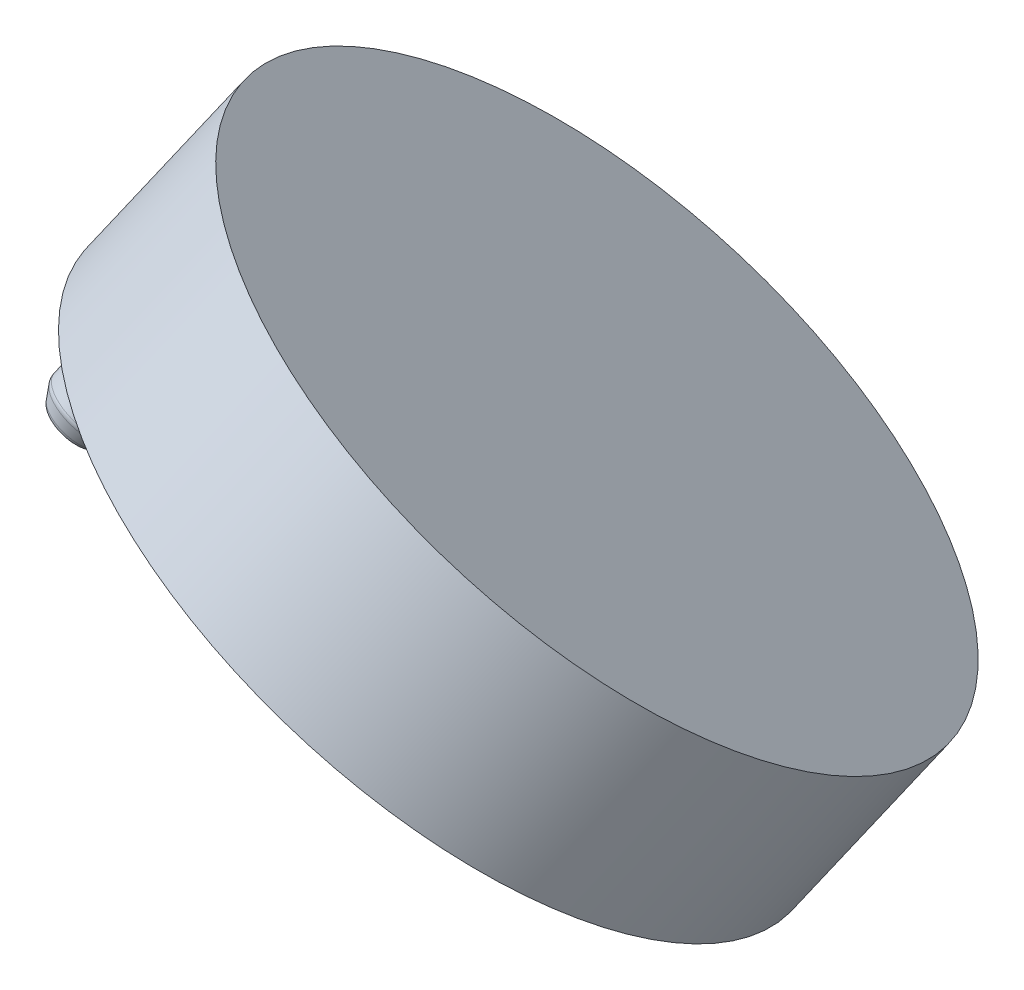
ISO-10303-21;
HEADER;
FILE_DESCRIPTION(('STEP AP214'),'2;1');
FILE_NAME('part.step','',(''),(''),'','','');
FILE_SCHEMA(('AUTOMOTIVE_DESIGN { 1 0 10303 214 1 1 1 1 }'));
ENDSEC;
DATA;
#1=APPLICATION_CONTEXT('core data for automotive mechanical design processes');
#2=APPLICATION_PROTOCOL_DEFINITION('international standard','automotive_design',2000,#1);
#3=PRODUCT_CONTEXT('',#1,'mechanical');
#4=PRODUCT('Part','Part','',(#3));
#5=PRODUCT_RELATED_PRODUCT_CATEGORY('part','',(#4));
#6=PRODUCT_DEFINITION_FORMATION('','',#4);
#7=PRODUCT_DEFINITION_CONTEXT('part definition',#1,'design');
#8=PRODUCT_DEFINITION('design','',#6,#7);
#9=PRODUCT_DEFINITION_SHAPE('','',#8);
#10=(LENGTH_UNIT() NAMED_UNIT(*) SI_UNIT(.MILLI.,.METRE.));
#11=(NAMED_UNIT(*) PLANE_ANGLE_UNIT() SI_UNIT($,.RADIAN.));
#12=(NAMED_UNIT(*) SI_UNIT($,.STERADIAN.) SOLID_ANGLE_UNIT());
#13=UNCERTAINTY_MEASURE_WITH_UNIT(LENGTH_MEASURE(1.E-05),#10,'distance_accuracy_value','');
#14=(GEOMETRIC_REPRESENTATION_CONTEXT(3) GLOBAL_UNCERTAINTY_ASSIGNED_CONTEXT((#13)) GLOBAL_UNIT_ASSIGNED_CONTEXT((#10,
#11,#12)) REPRESENTATION_CONTEXT('',''));
#15=CARTESIAN_POINT('',(0.,0.,0.));
#16=DIRECTION('',(0.,0.,1.));
#17=DIRECTION('',(1.,0.,0.));
#18=AXIS2_PLACEMENT_3D('',#15,#16,#17);
#19=CARTESIAN_POINT('',(52.6856644000798,6.81855203470048,-324.464564541766));
#20=DIRECTION('',(-0.419843522150938,-0.787526702107619,0.451146440056212));
#21=DIRECTION('',(0.,-0.497078203024789,-0.867705745098905));
#22=AXIS2_PLACEMENT_3D('',#19,#20,#21);
#23=CYLINDRICAL_SURFACE('',#22,35.2071254575037);
#24=CARTESIAN_POINT('',(42.7325198838464,-11.8511824328279,-313.769328152602));
#25=DIRECTION('',(0.419843522150938,0.787526702107619,-0.451146440056212));
#26=DIRECTION('',(0.,0.497078203024789,0.867705745098905));
#27=AXIS2_PLACEMENT_3D('',#24,#25,#26);
#28=CIRCLE('',#27,35.2071254575037);
#29=CARTESIAN_POINT('',(42.7325198838464,5.64951222325637,-283.219903124708));
#30=VERTEX_POINT('',#29);
#31=EDGE_CURVE('E120',#30,#30,#28,.T.);
#32=ORIENTED_EDGE('',*,*,#31,.T.);
#33=EDGE_LOOP('',(#32));
#34=FACE_BOUND('',#33,.T.);
#35=CARTESIAN_POINT('',(35.8079548096121,-24.8400213900258,-306.328477651507));
#36=DIRECTION('',(-0.419843522150938,-0.787526702107619,0.451146440056211));
#37=DIRECTION('',(0.,-0.497078203024789,-0.867705745098905));
#38=AXIS2_PLACEMENT_3D('',#35,#36,#37);
#39=CIRCLE('',#38,35.2071254575037);
#40=CARTESIAN_POINT('',(35.8079548096121,-42.3407160461101,-336.877902679401));
#41=VERTEX_POINT('',#40);
#42=EDGE_CURVE('E138',#41,#41,#39,.T.);
#43=ORIENTED_EDGE('',*,*,#42,.T.);
#44=EDGE_LOOP('',(#43));
#45=FACE_BOUND('',#44,.T.);
#46=ADVANCED_FACE('F46',(#34,#45),#23,.F.);
#47=CARTESIAN_POINT('',(57.0670686657183,-35.8673241933257,-372.291082093119));
#48=DIRECTION('',(-0.419843522150938,-0.787526702107619,0.451146440056211));
#49=DIRECTION('',(0.,-0.497078203024789,-0.867705745098905));
#50=AXIS2_PLACEMENT_3D('',#47,#48,#49);
#51=CYLINDRICAL_SURFACE('',#50,7.9375);
#52=CARTESIAN_POINT('',(44.9965674038789,-58.5087168789197,-359.320621941503));
#53=DIRECTION('',(-0.419843522150934,-0.78752670210762,0.451146440056212));
#54=DIRECTION('',(0.,-0.497078203024789,-0.867705745098906));
#55=AXIS2_PLACEMENT_3D('',#52,#53,#54);
#56=CIRCLE('',#55,7.9375);
#57=CARTESIAN_POINT('',(44.9965674038789,-62.454275115429,-366.208036293226));
#58=VERTEX_POINT('',#57);
#59=EDGE_CURVE('E74',#58,#58,#56,.T.);
#60=ORIENTED_EDGE('',*,*,#59,.T.);
#61=EDGE_LOOP('',(#60));
#62=FACE_BOUND('',#61,.T.);
#63=CARTESIAN_POINT('',(53.0757021640282,-43.3541794909259,-368.002125152753));
#64=DIRECTION('',(0.419843522150938,0.787526702107619,-0.451146440056212));
#65=DIRECTION('',(0.,0.497078203024789,0.867705745098905));
#66=AXIS2_PLACEMENT_3D('',#63,#64,#65);
#67=CIRCLE('',#66,7.9375);
#68=CARTESIAN_POINT('',(53.0757021640282,-39.4086212544166,-361.11471080103));
#69=VERTEX_POINT('',#68);
#70=EDGE_CURVE('E127',#69,#69,#67,.F.);
#71=ORIENTED_EDGE('',*,*,#70,.F.);
#72=EDGE_LOOP('',(#71));
#73=FACE_BOUND('',#72,.T.);
#74=ADVANCED_FACE('F186',(#62,#73),#51,.F.);
#75=CARTESIAN_POINT('',(-5.27065020165846,31.8518464060446,-312.092075233912));
#76=DIRECTION('',(-0.419843522150938,-0.787526702107619,0.451146440056211));
#77=DIRECTION('',(0.,-0.497078203024789,-0.867705745098905));
#78=AXIS2_PLACEMENT_3D('',#75,#76,#77);
#79=CYLINDRICAL_SURFACE('',#78,7.9375);
#80=CARTESIAN_POINT('',(-17.3411514634979,9.21045372045059,-299.121615082296));
#81=DIRECTION('',(-0.419843522150937,-0.787526702107617,0.451146440056215));
#82=DIRECTION('',(0.,-0.497078203024793,-0.867705745098903));
#83=AXIS2_PLACEMENT_3D('',#80,#81,#82);
#84=CIRCLE('',#83,7.9375);
#85=CARTESIAN_POINT('',(-17.3411514634979,5.2648954839413,-306.009029434018));
#86=VERTEX_POINT('',#85);
#87=EDGE_CURVE('E10',#86,#86,#84,.T.);
#88=ORIENTED_EDGE('',*,*,#87,.T.);
#89=EDGE_LOOP('',(#88));
#90=FACE_BOUND('',#89,.T.);
#91=CARTESIAN_POINT('',(-9.2620167033486,24.3649911084444,-307.803118293545));
#92=DIRECTION('',(0.419843522150938,0.787526702107619,-0.451146440056212));
#93=DIRECTION('',(0.,0.497078203024789,0.867705745098905));
#94=AXIS2_PLACEMENT_3D('',#91,#92,#93);
#95=CIRCLE('',#94,7.9375);
#96=CARTESIAN_POINT('',(-9.2620167033486,28.3105493449537,-300.915703941823));
#97=VERTEX_POINT('',#96);
#98=EDGE_CURVE('E152',#97,#97,#95,.F.);
#99=ORIENTED_EDGE('',*,*,#98,.F.);
#100=EDGE_LOOP('',(#99));
#101=FACE_BOUND('',#100,.T.);
#102=ADVANCED_FACE('F191',(#90,#101),#79,.F.);
#103=CARTESIAN_POINT('',(39.781336329203,33.470727202409,-267.340095018432));
#104=DIRECTION('',(-0.419843522150938,-0.787526702107619,0.451146440056211));
#105=DIRECTION('',(0.,-0.497078203024789,-0.867705745098905));
#106=AXIS2_PLACEMENT_3D('',#103,#104,#105);
#107=CYLINDRICAL_SURFACE('',#106,7.9375);
#108=CARTESIAN_POINT('',(27.7108350673636,10.829334516815,-254.369634866816));
#109=DIRECTION('',(-0.419843522150935,-0.787526702107613,0.451146440056224));
#110=DIRECTION('',(0.,-0.497078203024802,-0.867705745098898));
#111=AXIS2_PLACEMENT_3D('',#108,#109,#110);
#112=CIRCLE('',#111,7.9375);
#113=CARTESIAN_POINT('',(27.7108350673636,6.88377628030566,-261.257049218539));
#114=VERTEX_POINT('',#113);
#115=EDGE_CURVE('E55',#114,#114,#112,.T.);
#116=ORIENTED_EDGE('',*,*,#115,.T.);
#117=EDGE_LOOP('',(#116));
#118=FACE_BOUND('',#117,.T.);
#119=CARTESIAN_POINT('',(35.7899698275128,25.9838719048088,-263.051138078066));
#120=DIRECTION('',(0.419843522150938,0.787526702107619,-0.451146440056212));
#121=DIRECTION('',(0.,0.497078203024789,0.867705745098905));
#122=AXIS2_PLACEMENT_3D('',#119,#120,#121);
#123=CIRCLE('',#122,7.9375);
#124=CARTESIAN_POINT('',(35.7899698275128,29.929430141318,-256.163723726343));
#125=VERTEX_POINT('',#124);
#126=EDGE_CURVE('E156',#125,#125,#123,.F.);
#127=ORIENTED_EDGE('',*,*,#126,.F.);
#128=EDGE_LOOP('',(#127));
#129=FACE_BOUND('',#128,.T.);
#130=ADVANCED_FACE('F182',(#118,#129),#107,.F.);
#131=CARTESIAN_POINT('',(93.4614470495499,0.415666833468258,-275.085907942506));
#132=DIRECTION('',(-0.419843522150938,-0.787526702107619,0.451146440056211));
#133=DIRECTION('',(0.,-0.497078203024789,-0.867705745098905));
#134=AXIS2_PLACEMENT_3D('',#131,#132,#133);
#135=CYLINDRICAL_SURFACE('',#134,7.9375);
#136=CARTESIAN_POINT('',(81.3909457877105,-22.2257258521259,-262.11544779089));
#137=DIRECTION('',(-0.419843522150937,-0.787526702107626,0.4511464400562));
#138=DIRECTION('',(0.,-0.497078203024776,-0.867705745098913));
#139=AXIS2_PLACEMENT_3D('',#136,#137,#138);
#140=CIRCLE('',#139,7.9375);
#141=CARTESIAN_POINT('',(81.3909457877105,-26.171284088635,-269.002862142613));
#142=VERTEX_POINT('',#141);
#143=EDGE_CURVE('E62',#142,#142,#140,.T.);
#144=ORIENTED_EDGE('',*,*,#143,.T.);
#145=EDGE_LOOP('',(#144));
#146=FACE_BOUND('',#145,.T.);
#147=CARTESIAN_POINT('',(89.4700805478598,-7.07118846413194,-270.79695100214));
#148=DIRECTION('',(0.419843522150938,0.787526702107619,-0.451146440056212));
#149=DIRECTION('',(0.,0.497078203024789,0.867705745098905));
#150=AXIS2_PLACEMENT_3D('',#147,#148,#149);
#151=CIRCLE('',#150,7.9375);
#152=CARTESIAN_POINT('',(89.4700805478598,-3.12563022762267,-263.909536650417));
#153=VERTEX_POINT('',#152);
#154=EDGE_CURVE('E160',#153,#153,#151,.F.);
#155=ORIENTED_EDGE('',*,*,#154,.F.);
#156=EDGE_LOOP('',(#155));
#157=FACE_BOUND('',#156,.T.);
#158=ADVANCED_FACE('F173',(#146,#157),#135,.F.);
#159=CARTESIAN_POINT('',(102.101617059717,-34.2346517905639,-327.531255269114));
#160=DIRECTION('',(-0.419843522150938,-0.787526702107619,0.451146440056211));
#161=DIRECTION('',(0.,-0.497078203024789,-0.867705745098905));
#162=AXIS2_PLACEMENT_3D('',#159,#160,#161);
#163=CYLINDRICAL_SURFACE('',#162,7.93750000000003);
#164=CARTESIAN_POINT('',(90.031115797878,-56.876044476158,-314.560795117497));
#165=DIRECTION('',(-0.419843522150933,-0.787526702107617,0.45114644005622));
#166=DIRECTION('',(0.,-0.497078203024797,-0.867705745098901));
#167=AXIS2_PLACEMENT_3D('',#164,#165,#166);
#168=CIRCLE('',#167,7.93750000000003);
#169=CARTESIAN_POINT('',(90.031115797878,-60.8216027126674,-321.44820946922));
#170=VERTEX_POINT('',#169);
#171=EDGE_CURVE('E69',#170,#170,#168,.T.);
#172=ORIENTED_EDGE('',*,*,#171,.T.);
#173=EDGE_LOOP('',(#172));
#174=FACE_BOUND('',#173,.T.);
#175=CARTESIAN_POINT('',(98.1102505580274,-41.7215070881641,-323.242298328747));
#176=DIRECTION('',(0.419843522150938,0.787526702107619,-0.451146440056212));
#177=DIRECTION('',(0.,0.497078203024789,0.867705745098905));
#178=AXIS2_PLACEMENT_3D('',#175,#176,#177);
#179=CIRCLE('',#178,7.93750000000003);
#180=CARTESIAN_POINT('',(98.1102505580274,-37.7759488516548,-316.354883977025));
#181=VERTEX_POINT('',#180);
#182=EDGE_CURVE('E132',#181,#181,#179,.F.);
#183=ORIENTED_EDGE('',*,*,#182,.F.);
#184=EDGE_LOOP('',(#183));
#185=FACE_BOUND('',#184,.T.);
#186=ADVANCED_FACE('F170',(#174,#185),#163,.F.);
#187=CARTESIAN_POINT('',(3.35977886493976,-2.81049163858387,-364.567468872575));
#188=DIRECTION('',(-0.419843522150938,-0.787526702107619,0.451146440056211));
#189=DIRECTION('',(0.,-0.497078203024789,-0.867705745098905));
#190=AXIS2_PLACEMENT_3D('',#187,#188,#189);
#191=CYLINDRICAL_SURFACE('',#190,7.9375);
#192=CARTESIAN_POINT('',(-8.71072239689973,-25.451884324178,-351.597008720959));
#193=DIRECTION('',(-0.419843522150941,-0.787526702107623,0.451146440056202));
#194=DIRECTION('',(0.,-0.49707820302478,-0.867705745098911));
#195=AXIS2_PLACEMENT_3D('',#192,#193,#194);
#196=CIRCLE('',#195,7.9375);
#197=CARTESIAN_POINT('',(-8.71072239689973,-29.3974425606872,-358.484423072681));
#198=VERTEX_POINT('',#197);
#199=EDGE_CURVE('E100',#198,#198,#196,.T.);
#200=ORIENTED_EDGE('',*,*,#199,.T.);
#201=EDGE_LOOP('',(#200));
#202=FACE_BOUND('',#201,.T.);
#203=CARTESIAN_POINT('',(-0.631587636750388,-10.2973469361841,-360.278511932209));
#204=DIRECTION('',(0.419843522150938,0.787526702107619,-0.451146440056212));
#205=DIRECTION('',(0.,0.497078203024789,0.867705745098905));
#206=AXIS2_PLACEMENT_3D('',#203,#204,#205);
#207=CIRCLE('',#206,7.9375);
#208=CARTESIAN_POINT('',(-0.631587636750388,-6.3517886996748,-353.391097580486));
#209=VERTEX_POINT('',#208);
#210=EDGE_CURVE('E128',#209,#209,#207,.F.);
#211=ORIENTED_EDGE('',*,*,#210,.F.);
#212=EDGE_LOOP('',(#211));
#213=FACE_BOUND('',#212,.T.);
#214=ADVANCED_FACE('F172',(#202,#213),#191,.F.);
#215=CARTESIAN_POINT('',(52.6856644000798,6.81855203470048,-324.464564541766));
#216=DIRECTION('',(-0.419843522150938,-0.787526702107619,0.451146440056212));
#217=DIRECTION('',(0.,-0.497078203024789,-0.867705745098905));
#218=AXIS2_PLACEMENT_3D('',#215,#216,#217);
#219=CYLINDRICAL_SURFACE('',#218,76.2);
#220=CARTESIAN_POINT('',(52.6856644000798,6.81855203470048,-324.464564541766));
#221=DIRECTION('',(-0.419843522150938,-0.787526702107619,0.451146440056211));
#222=DIRECTION('',(0.,-0.497078203024789,-0.867705745098905));
#223=AXIS2_PLACEMENT_3D('',#220,#221,#222);
#224=CIRCLE('',#223,76.2);
#225=CARTESIAN_POINT('',(52.6856644000798,-31.0588070357884,-390.583742318303));
#226=VERTEX_POINT('',#225);
#227=EDGE_CURVE('E133',#226,#226,#224,.T.);
#228=ORIENTED_EDGE('',*,*,#227,.T.);
#229=EDGE_LOOP('',(#228));
#230=FACE_BOUND('',#229,.T.);
#231=CARTESIAN_POINT('',(35.8079548096121,-24.8400213900258,-306.328477651507));
#232=DIRECTION('',(-0.419843522150938,-0.787526702107619,0.451146440056211));
#233=DIRECTION('',(0.,-0.497078203024789,-0.867705745098905));
#234=AXIS2_PLACEMENT_3D('',#231,#232,#233);
#235=CIRCLE('',#234,76.2);
#236=CARTESIAN_POINT('',(35.8079548096121,-62.7173804605147,-372.447655428043));
#237=VERTEX_POINT('',#236);
#238=EDGE_CURVE('E134',#237,#237,#235,.T.);
#239=ORIENTED_EDGE('',*,*,#238,.F.);
#240=EDGE_LOOP('',(#239));
#241=FACE_BOUND('',#240,.T.);
#242=ADVANCED_FACE('F179',(#230,#241),#219,.T.);
#243=CARTESIAN_POINT('',(52.6856644000798,6.81855203470048,-324.464564541766));
#244=DIRECTION('',(-0.419843522150938,-0.787526702107619,0.451146440056211));
#245=DIRECTION('',(0.,-0.497078203024789,-0.867705745098905));
#246=AXIS2_PLACEMENT_3D('',#243,#244,#245);
#247=PLANE('',#246);
#248=ORIENTED_EDGE('',*,*,#227,.F.);
#249=EDGE_LOOP('',(#248));
#250=FACE_BOUND('',#249,.T.);
#251=ADVANCED_FACE('F197',(#250),#247,.F.);
#252=CARTESIAN_POINT('',(35.8079548096121,-24.8400213900258,-306.328477651507));
#253=DIRECTION('',(-0.419843522150938,-0.787526702107619,0.451146440056211));
#254=DIRECTION('',(0.,-0.497078203024789,-0.867705745098905));
#255=AXIS2_PLACEMENT_3D('',#252,#253,#254);
#256=PLANE('',#255);
#257=CARTESIAN_POINT('',(-9.23552679958838,-26.4362927018125,-351.033075670889));
#258=DIRECTION('',(-0.419843522150938,-0.787526702107619,0.451146440056211));
#259=DIRECTION('',(0.,-0.497078203024789,-0.867705745098905));
#260=AXIS2_PLACEMENT_3D('',#257,#258,#259);
#261=CIRCLE('',#260,9.18750000000008);
#262=CARTESIAN_POINT('',(-9.23552679958838,-31.0031986921028,-359.005122203985));
#263=VERTEX_POINT('',#262);
#264=EDGE_CURVE('E77',#263,#263,#261,.F.);
#265=ORIENTED_EDGE('',*,*,#264,.T.);
#266=EDGE_LOOP('',(#265));
#267=FACE_BOUND('',#266,.T.);
#268=CARTESIAN_POINT('',(44.4717630011902,-59.4931252565543,-358.756688891433));
#269=DIRECTION('',(-0.419843522150938,-0.787526702107619,0.451146440056211));
#270=DIRECTION('',(0.,-0.497078203024789,-0.867705745098905));
#271=AXIS2_PLACEMENT_3D('',#268,#269,#270);
#272=CIRCLE('',#271,9.1875);
#273=CARTESIAN_POINT('',(44.4717630011902,-64.0600312468445,-366.728735424529));
#274=VERTEX_POINT('',#273);
#275=EDGE_CURVE('E81',#274,#274,#272,.F.);
#276=ORIENTED_EDGE('',*,*,#275,.T.);
#277=EDGE_LOOP('',(#276));
#278=FACE_BOUND('',#277,.T.);
#279=CARTESIAN_POINT('',(89.5063113951894,-57.8604528537925,-313.996862067427));
#280=DIRECTION('',(-0.419843522150938,-0.787526702107619,0.451146440056211));
#281=DIRECTION('',(0.,-0.497078203024789,-0.867705745098905));
#282=AXIS2_PLACEMENT_3D('',#279,#280,#281);
#283=CIRCLE('',#282,9.18749999999991);
#284=CARTESIAN_POINT('',(89.5063113951894,-62.4273588440827,-321.968908600523));
#285=VERTEX_POINT('',#284);
#286=EDGE_CURVE('E85',#285,#285,#283,.F.);
#287=ORIENTED_EDGE('',*,*,#286,.T.);
#288=EDGE_LOOP('',(#287));
#289=FACE_BOUND('',#288,.T.);
#290=CARTESIAN_POINT('',(80.8661413850218,-23.2101342297603,-261.55151474082));
#291=DIRECTION('',(-0.419843522150938,-0.787526702107619,0.451146440056211));
#292=DIRECTION('',(0.,-0.497078203024789,-0.867705745098905));
#293=AXIS2_PLACEMENT_3D('',#290,#291,#292);
#294=CIRCLE('',#293,9.18750000000012);
#295=CARTESIAN_POINT('',(80.8661413850218,-27.7770402200507,-269.523561273916));
#296=VERTEX_POINT('',#295);
#297=EDGE_CURVE('E89',#296,#296,#294,.F.);
#298=ORIENTED_EDGE('',*,*,#297,.T.);
#299=EDGE_LOOP('',(#298));
#300=FACE_BOUND('',#299,.T.);
#301=CARTESIAN_POINT('',(27.1860306646748,9.84492613918036,-253.805701816746));
#302=DIRECTION('',(-0.419843522150938,-0.787526702107619,0.451146440056211));
#303=DIRECTION('',(0.,-0.497078203024789,-0.867705745098905));
#304=AXIS2_PLACEMENT_3D('',#301,#302,#303);
#305=CIRCLE('',#304,9.1875);
#306=CARTESIAN_POINT('',(27.1860306646748,5.27802014889011,-261.777748349842));
#307=VERTEX_POINT('',#306);
#308=EDGE_CURVE('E93',#307,#307,#305,.F.);
#309=ORIENTED_EDGE('',*,*,#308,.T.);
#310=EDGE_LOOP('',(#309));
#311=FACE_BOUND('',#310,.T.);
#312=CARTESIAN_POINT('',(-17.8659558661866,8.22604534281602,-298.557682032225));
#313=DIRECTION('',(-0.419843522150938,-0.787526702107619,0.451146440056211));
#314=DIRECTION('',(0.,-0.497078203024789,-0.867705745098905));
#315=AXIS2_PLACEMENT_3D('',#312,#313,#314);
#316=CIRCLE('',#315,9.18749999999996);
#317=CARTESIAN_POINT('',(-17.8659558661866,3.65913935252579,-306.529728565321));
#318=VERTEX_POINT('',#317);
#319=EDGE_CURVE('E96',#318,#318,#316,.F.);
#320=ORIENTED_EDGE('',*,*,#319,.T.);
#321=EDGE_LOOP('',(#320));
#322=FACE_BOUND('',#321,.T.);
#323=CARTESIAN_POINT('',(-0.147060364526407,14.2556897080688,-271.542796496672));
#324=DIRECTION('',(-0.419843522150938,-0.787526702107619,0.451146440056211));
#325=DIRECTION('',(0.,-0.497078203024789,-0.867705745098905));
#326=AXIS2_PLACEMENT_3D('',#323,#324,#325);
#327=CIRCLE('',#326,7.77968966364629);
#328=CARTESIAN_POINT('',(-0.147060364526407,10.3885755499729,-278.293277912905));
#329=VERTEX_POINT('',#328);
#330=EDGE_CURVE('E145',#329,#329,#327,.T.);
#331=ORIENTED_EDGE('',*,*,#330,.F.);
#332=EDGE_LOOP('',(#331));
#333=FACE_BOUND('',#332,.T.);
#334=ORIENTED_EDGE('',*,*,#42,.F.);
#335=EDGE_LOOP('',(#334));
#336=FACE_BOUND('',#335,.T.);
#337=ORIENTED_EDGE('',*,*,#238,.T.);
#338=EDGE_LOOP('',(#337));
#339=FACE_BOUND('',#338,.T.);
#340=ADVANCED_FACE('F200',(#267,#278,#289,#300,#311,#322,#333,#336,#339),#256,.T.);
#341=CARTESIAN_POINT('',(-5.46608724942705,4.27845895403172,-265.827190760058));
#342=DIRECTION('',(0.419843522150938,0.787526702107619,-0.451146440056211));
#343=DIRECTION('',(0.,0.497078203024789,0.867705745098905));
#344=AXIS2_PLACEMENT_3D('',#341,#342,#343);
#345=CYLINDRICAL_SURFACE('',#344,7.77968966364629);
#346=CARTESIAN_POINT('',(-3.56251350800053,7.84911104632562,-267.872692170749));
#347=DIRECTION('',(-0.419843522150937,-0.787526702107619,0.451146440056212));
#348=DIRECTION('',(0.,-0.49707820302479,-0.867705745098905));
#349=AXIS2_PLACEMENT_3D('',#346,#347,#348);
#350=CIRCLE('',#349,7.77968966364629);
#351=CARTESIAN_POINT('',(-3.56251350800053,3.98199688822979,-274.623173586981));
#352=VERTEX_POINT('',#351);
#353=EDGE_CURVE('E104',#352,#352,#350,.F.);
#354=ORIENTED_EDGE('',*,*,#353,.T.);
#355=EDGE_LOOP('',(#354));
#356=FACE_BOUND('',#355,.T.);
#357=ORIENTED_EDGE('',*,*,#330,.T.);
#358=EDGE_LOOP('',(#357));
#359=FACE_BOUND('',#358,.T.);
#360=ADVANCED_FACE('F204',(#356,#359),#345,.T.);
#361=CARTESIAN_POINT('',(-5.46608724942705,4.27845895403172,-265.827190760058));
#362=DIRECTION('',(-0.419843522150938,-0.787526702107619,0.451146440056211));
#363=DIRECTION('',(0.,-0.497078203024789,-0.867705745098905));
#364=AXIS2_PLACEMENT_3D('',#361,#362,#363);
#365=PLANE('',#364);
#366=CARTESIAN_POINT('',(-5.46608724942704,4.27845895403173,-265.827190760058));
#367=DIRECTION('',(-0.419843522150938,-0.787526702107619,0.451146440056211));
#368=DIRECTION('',(0.,-0.497078203024789,-0.867705745098905));
#369=AXIS2_PLACEMENT_3D('',#366,#367,#368);
#370=CIRCLE('',#369,4.32263526463448);
#371=CARTESIAN_POINT('',(-5.46608724942704,2.12977118435564,-269.577966213149));
#372=VERTEX_POINT('',#371);
#373=EDGE_CURVE('E116',#372,#372,#370,.T.);
#374=ORIENTED_EDGE('',*,*,#373,.T.);
#375=EDGE_LOOP('',(#374));
#376=FACE_BOUND('',#375,.T.);
#377=ADVANCED_FACE('F217',(#376),#365,.T.);
#378=CARTESIAN_POINT('',(-5.46608724942705,4.27845895403172,-265.827190760058));
#379=DIRECTION('',(0.419843522150937,0.787526702107618,-0.451146440056213));
#380=DIRECTION('',(0.,0.497078203024791,0.867705745098904));
#381=AXIS2_PLACEMENT_3D('',#378,#379,#380);
#382=CONICAL_SURFACE('',#381,5.47968966364636,0.521834279814398);
#383=CARTESIAN_POINT('',(-5.04495995012327,5.06839371708128,-266.279716693811));
#384=DIRECTION('',(-0.419843522150938,-0.787526702107619,0.451146440056211));
#385=DIRECTION('',(0.,-0.497078203024789,-0.867705745098905));
#386=AXIS2_PLACEMENT_3D('',#383,#384,#385);
#387=CIRCLE('',#386,6.05644787074955);
#388=CARTESIAN_POINT('',(-5.04495995012327,2.05786549277578,-271.534931306152));
#389=VERTEX_POINT('',#388);
#390=EDGE_CURVE('E108',#389,#389,#387,.F.);
#391=ORIENTED_EDGE('',*,*,#390,.T.);
#392=EDGE_LOOP('',(#391));
#393=FACE_BOUND('',#392,.T.);
#394=CARTESIAN_POINT('',(-3.98107325299862,7.06399240515995,-267.422925224389));
#395=DIRECTION('',(0.419843522150937,0.787526702107618,-0.451146440056213));
#396=DIRECTION('',(0.,0.497078203024791,0.867705745098904));
#397=AXIS2_PLACEMENT_3D('',#394,#395,#396);
#398=CIRCLE('',#397,7.51350226976141);
#399=CARTESIAN_POINT('',(-3.98107325299862,10.7987906118356,-260.903416139104));
#400=VERTEX_POINT('',#399);
#401=EDGE_CURVE('E112',#400,#400,#398,.F.);
#402=ORIENTED_EDGE('',*,*,#401,.T.);
#403=EDGE_LOOP('',(#402));
#404=FACE_BOUND('',#403,.T.);
#405=ADVANCED_FACE('F210',(#393,#404),#382,.T.);
#406=CARTESIAN_POINT('',(44.4118939724501,-8.70107562439742,-315.573913912827));
#407=DIRECTION('',(0.419843522150938,0.787526702107619,-0.451146440056212));
#408=DIRECTION('',(0.,0.497078203024789,0.867705745098905));
#409=AXIS2_PLACEMENT_3D('',#406,#407,#408);
#410=PLANE('',#409);
#411=ORIENTED_EDGE('',*,*,#210,.T.);
#412=EDGE_LOOP('',(#411));
#413=FACE_BOUND('',#412,.T.);
#414=ADVANCED_FACE('F216',(#413),#410,.F.);
#415=ORIENTED_EDGE('',*,*,#182,.T.);
#416=EDGE_LOOP('',(#415));
#417=FACE_BOUND('',#416,.T.);
#418=ADVANCED_FACE('F168',(#417),#410,.F.);
#419=ORIENTED_EDGE('',*,*,#154,.T.);
#420=EDGE_LOOP('',(#419));
#421=FACE_BOUND('',#420,.T.);
#422=ADVANCED_FACE('F303',(#421),#410,.F.);
#423=ORIENTED_EDGE('',*,*,#126,.T.);
#424=EDGE_LOOP('',(#423));
#425=FACE_BOUND('',#424,.T.);
#426=ADVANCED_FACE('F298',(#425),#410,.F.);
#427=ORIENTED_EDGE('',*,*,#98,.T.);
#428=EDGE_LOOP('',(#427));
#429=FACE_BOUND('',#428,.T.);
#430=ADVANCED_FACE('F295',(#429),#410,.F.);
#431=ORIENTED_EDGE('',*,*,#70,.T.);
#432=EDGE_LOOP('',(#431));
#433=FACE_BOUND('',#432,.T.);
#434=ADVANCED_FACE('F297',(#433),#410,.F.);
#435=CARTESIAN_POINT('',(44.4118939724501,-8.70107562439739,-315.573913912827));
#436=DIRECTION('',(0.419843522150938,0.787526702107619,-0.451146440056212));
#437=DIRECTION('',(0.,0.497078203024789,0.867705745098905));
#438=AXIS2_PLACEMENT_3D('',#435,#436,#437);
#439=CIRCLE('',#438,31.2071254575037);
#440=CARTESIAN_POINT('',(44.4118939724501,6.81130621958771,-288.495311865328));
#441=VERTEX_POINT('',#440);
#442=EDGE_CURVE('E123',#441,#441,#439,.F.);
#443=ORIENTED_EDGE('',*,*,#442,.T.);
#444=EDGE_LOOP('',(#443));
#445=FACE_BOUND('',#444,.T.);
#446=ADVANCED_FACE('F223',(#445),#410,.F.);
#447=CARTESIAN_POINT('',(42.7325198838464,-11.8511824328279,-313.769328152602));
#448=DIRECTION('',(0.419843522150938,0.787526702107619,-0.451146440056212));
#449=DIRECTION('',(0.,0.497078203024789,0.867705745098905));
#450=AXIS2_PLACEMENT_3D('',#447,#448,#449);
#451=TOROIDAL_SURFACE('',#450,31.2071254575037,4.);
#452=ORIENTED_EDGE('',*,*,#31,.F.);
#453=EDGE_LOOP('',(#452));
#454=FACE_BOUND('',#453,.T.);
#455=ORIENTED_EDGE('',*,*,#442,.F.);
#456=EDGE_LOOP('',(#455));
#457=FACE_BOUND('',#456,.T.);
#458=ADVANCED_FACE('F219',(#454,#457),#451,.F.);
#459=CARTESIAN_POINT('',(-4.62640020512517,5.85351235824696,-266.729483640171));
#460=DIRECTION('',(-0.419843522150938,-0.787526702107619,0.451146440056211));
#461=DIRECTION('',(0.,-0.497078203024789,-0.867705745098905));
#462=AXIS2_PLACEMENT_3D('',#459,#460,#461);
#463=TOROIDAL_SURFACE('',#462,4.32263526463448,2.);
#464=ORIENTED_EDGE('',*,*,#390,.F.);
#465=EDGE_LOOP('',(#464));
#466=FACE_BOUND('',#465,.T.);
#467=ORIENTED_EDGE('',*,*,#373,.F.);
#468=EDGE_LOOP('',(#467));
#469=FACE_BOUND('',#468,.T.);
#470=ADVANCED_FACE('F222',(#466,#469),#463,.T.);
#471=CARTESIAN_POINT('',(-3.56251350800053,7.84911104632562,-267.872692170749));
#472=DIRECTION('',(-0.419843522150937,-0.787526702107619,0.451146440056212));
#473=DIRECTION('',(0.,-0.49707820302479,-0.867705745098905));
#474=AXIS2_PLACEMENT_3D('',#471,#472,#473);
#475=TOROIDAL_SURFACE('',#474,5.77968966364633,2.);
#476=ORIENTED_EDGE('',*,*,#401,.F.);
#477=EDGE_LOOP('',(#476));
#478=FACE_BOUND('',#477,.T.);
#479=ORIENTED_EDGE('',*,*,#353,.F.);
#480=EDGE_LOOP('',(#479));
#481=FACE_BOUND('',#480,.T.);
#482=ADVANCED_FACE('F227',(#478,#481),#475,.T.);
#483=CARTESIAN_POINT('',(-8.71072239689971,-25.451884324178,-351.597008720959));
#484=DIRECTION('',(-0.419843522150941,-0.787526702107623,0.451146440056202));
#485=DIRECTION('',(0.,-0.49707820302478,-0.867705745098911));
#486=AXIS2_PLACEMENT_3D('',#483,#484,#485);
#487=CONICAL_SURFACE('',#486,7.9375,0.78539816339746);
#488=ORIENTED_EDGE('',*,*,#264,.F.);
#489=EDGE_LOOP('',(#488));
#490=FACE_BOUND('',#489,.T.);
#491=ORIENTED_EDGE('',*,*,#199,.F.);
#492=EDGE_LOOP('',(#491));
#493=FACE_BOUND('',#492,.T.);
#494=ADVANCED_FACE('F231',(#490,#493),#487,.F.);
#495=CARTESIAN_POINT('',(44.9965674038789,-58.5087168789197,-359.320621941503));
#496=DIRECTION('',(-0.419843522150934,-0.78752670210762,0.451146440056212));
#497=DIRECTION('',(0.,-0.497078203024789,-0.867705745098906));
#498=AXIS2_PLACEMENT_3D('',#495,#496,#497);
#499=CONICAL_SURFACE('',#498,7.9375,0.785398163397425);
#500=ORIENTED_EDGE('',*,*,#275,.F.);
#501=EDGE_LOOP('',(#500));
#502=FACE_BOUND('',#501,.T.);
#503=ORIENTED_EDGE('',*,*,#59,.F.);
#504=EDGE_LOOP('',(#503));
#505=FACE_BOUND('',#504,.T.);
#506=ADVANCED_FACE('F238',(#502,#505),#499,.F.);
#507=CARTESIAN_POINT('',(90.031115797878,-56.876044476158,-314.560795117497));
#508=DIRECTION('',(-0.419843522150933,-0.787526702107617,0.45114644005622));
#509=DIRECTION('',(0.,-0.497078203024797,-0.867705745098901));
#510=AXIS2_PLACEMENT_3D('',#507,#508,#509);
#511=CONICAL_SURFACE('',#510,7.93750000000003,0.785398163397465);
#512=ORIENTED_EDGE('',*,*,#286,.F.);
#513=EDGE_LOOP('',(#512));
#514=FACE_BOUND('',#513,.T.);
#515=ORIENTED_EDGE('',*,*,#171,.F.);
#516=EDGE_LOOP('',(#515));
#517=FACE_BOUND('',#516,.T.);
#518=ADVANCED_FACE('F245',(#514,#517),#511,.F.);
#519=CARTESIAN_POINT('',(81.3909457877105,-22.2257258521258,-262.11544779089));
#520=DIRECTION('',(-0.419843522150937,-0.787526702107626,0.4511464400562));
#521=DIRECTION('',(0.,-0.497078203024776,-0.867705745098913));
#522=AXIS2_PLACEMENT_3D('',#519,#520,#521);
#523=CONICAL_SURFACE('',#522,7.9375,0.785398163397459);
#524=ORIENTED_EDGE('',*,*,#297,.F.);
#525=EDGE_LOOP('',(#524));
#526=FACE_BOUND('',#525,.T.);
#527=ORIENTED_EDGE('',*,*,#143,.F.);
#528=EDGE_LOOP('',(#527));
#529=FACE_BOUND('',#528,.T.);
#530=ADVANCED_FACE('F252',(#526,#529),#523,.F.);
#531=CARTESIAN_POINT('',(27.7108350673636,10.829334516815,-254.369634866816));
#532=DIRECTION('',(-0.419843522150935,-0.787526702107613,0.451146440056224));
#533=DIRECTION('',(0.,-0.497078203024802,-0.867705745098898));
#534=AXIS2_PLACEMENT_3D('',#531,#532,#533);
#535=CONICAL_SURFACE('',#534,7.9375,0.78539816339744);
#536=ORIENTED_EDGE('',*,*,#308,.F.);
#537=EDGE_LOOP('',(#536));
#538=FACE_BOUND('',#537,.T.);
#539=ORIENTED_EDGE('',*,*,#115,.F.);
#540=EDGE_LOOP('',(#539));
#541=FACE_BOUND('',#540,.T.);
#542=ADVANCED_FACE('F258',(#538,#541),#535,.F.);
#543=CARTESIAN_POINT('',(-17.3411514634979,9.2104537204506,-299.121615082296));
#544=DIRECTION('',(-0.419843522150937,-0.787526702107617,0.451146440056215));
#545=DIRECTION('',(0.,-0.497078203024793,-0.867705745098903));
#546=AXIS2_PLACEMENT_3D('',#543,#544,#545);
#547=CONICAL_SURFACE('',#546,7.9375,0.785398163397449);
#548=ORIENTED_EDGE('',*,*,#319,.F.);
#549=EDGE_LOOP('',(#548));
#550=FACE_BOUND('',#549,.T.);
#551=ORIENTED_EDGE('',*,*,#87,.F.);
#552=EDGE_LOOP('',(#551));
#553=FACE_BOUND('',#552,.T.);
#554=ADVANCED_FACE('F49',(#550,#553),#547,.F.);
#555=CLOSED_SHELL('',(#46,#74,#102,#130,#158,#186,#214,#242,#251,#340,#360,#377,#405,#414,#418,
#422,#426,#430,#434,#446,#458,#470,#482,#494,#506,#518,#530,#542,#554));
#556=MANIFOLD_SOLID_BREP('B2',#555);
#557=ADVANCED_BREP_SHAPE_REPRESENTATION('',(#18,#556),#14);
#558=SHAPE_DEFINITION_REPRESENTATION(#9,#557);
ENDSEC;
END-ISO-10303-21;
